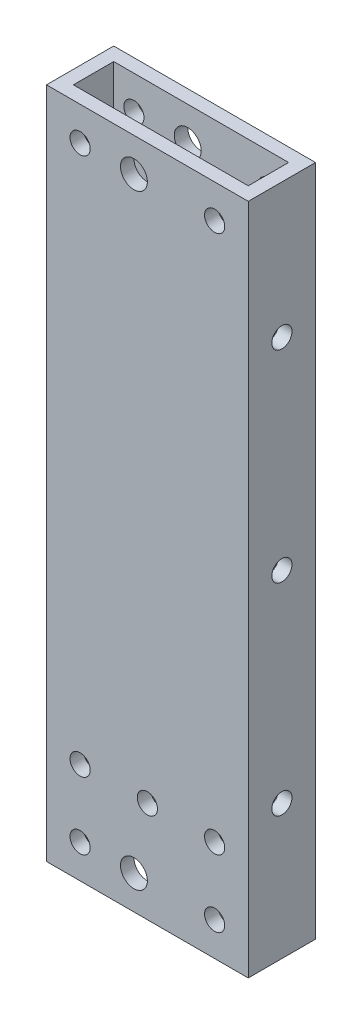
ISO-10303-21;
HEADER;
FILE_DESCRIPTION(('STEP AP214'),'2;1');
FILE_NAME('part.step','',(''),(''),'','','');
FILE_SCHEMA(('AUTOMOTIVE_DESIGN { 1 0 10303 214 1 1 1 1 }'));
ENDSEC;
DATA;
#1=APPLICATION_CONTEXT('core data for automotive mechanical design processes');
#2=APPLICATION_PROTOCOL_DEFINITION('international standard','automotive_design',2000,#1);
#3=PRODUCT_CONTEXT('',#1,'mechanical');
#4=PRODUCT('Part','Part','',(#3));
#5=PRODUCT_RELATED_PRODUCT_CATEGORY('part','',(#4));
#6=PRODUCT_DEFINITION_FORMATION('','',#4);
#7=PRODUCT_DEFINITION_CONTEXT('part definition',#1,'design');
#8=PRODUCT_DEFINITION('design','',#6,#7);
#9=PRODUCT_DEFINITION_SHAPE('','',#8);
#10=(LENGTH_UNIT() NAMED_UNIT(*) SI_UNIT(.MILLI.,.METRE.));
#11=(NAMED_UNIT(*) PLANE_ANGLE_UNIT() SI_UNIT($,.RADIAN.));
#12=(NAMED_UNIT(*) SI_UNIT($,.STERADIAN.) SOLID_ANGLE_UNIT());
#13=UNCERTAINTY_MEASURE_WITH_UNIT(LENGTH_MEASURE(1.E-05),#10,'distance_accuracy_value','');
#14=(GEOMETRIC_REPRESENTATION_CONTEXT(3) GLOBAL_UNCERTAINTY_ASSIGNED_CONTEXT((#13)) GLOBAL_UNIT_ASSIGNED_CONTEXT((#10,
#11,#12)) REPRESENTATION_CONTEXT('',''));
#15=CARTESIAN_POINT('',(0.,0.,0.));
#16=DIRECTION('',(0.,0.,1.));
#17=DIRECTION('',(1.,0.,0.));
#18=AXIS2_PLACEMENT_3D('',#15,#16,#17);
#19=CARTESIAN_POINT('',(0.,50.,0.));
#20=DIRECTION('',(0.,1.,0.));
#21=DIRECTION('',(0.,0.,1.));
#22=AXIS2_PLACEMENT_3D('',#19,#20,#21);
#23=PLANE('',#22);
#24=DIRECTION('',(0.,0.,-1.));
#25=VECTOR('',#24,1.);
#26=CARTESIAN_POINT('',(15.,50.,-5.));
#27=LINE('',#26,#25);
#28=CARTESIAN_POINT('',(15.,50.,5.));
#29=VERTEX_POINT('',#28);
#30=CARTESIAN_POINT('',(15.,50.,-5.));
#31=VERTEX_POINT('',#30);
#32=EDGE_CURVE('E140',#29,#31,#27,.T.);
#33=ORIENTED_EDGE('',*,*,#32,.T.);
#34=DIRECTION('',(-1.,0.,0.));
#35=VECTOR('',#34,1.);
#36=CARTESIAN_POINT('',(-15.,50.,-5.));
#37=LINE('',#36,#35);
#38=CARTESIAN_POINT('',(-15.,50.,-5.));
#39=VERTEX_POINT('',#38);
#40=EDGE_CURVE('E143',#31,#39,#37,.T.);
#41=ORIENTED_EDGE('',*,*,#40,.T.);
#42=DIRECTION('',(0.,0.,1.));
#43=VECTOR('',#42,1.);
#44=CARTESIAN_POINT('',(-15.,50.,-5.));
#45=LINE('',#44,#43);
#46=CARTESIAN_POINT('',(-15.,50.,5.));
#47=VERTEX_POINT('',#46);
#48=EDGE_CURVE('E146',#39,#47,#45,.T.);
#49=ORIENTED_EDGE('',*,*,#48,.T.);
#50=DIRECTION('',(1.,0.,0.));
#51=VECTOR('',#50,1.);
#52=CARTESIAN_POINT('',(-15.,50.,5.));
#53=LINE('',#52,#51);
#54=EDGE_CURVE('E148',#47,#29,#53,.T.);
#55=ORIENTED_EDGE('',*,*,#54,.T.);
#56=EDGE_LOOP('',(#33,#41,#49,#55));
#57=FACE_BOUND('',#56,.T.);
#58=DIRECTION('',(-1.,0.,0.));
#59=VECTOR('',#58,1.);
#60=CARTESIAN_POINT('',(-13.,50.,-3.));
#61=LINE('',#60,#59);
#62=CARTESIAN_POINT('',(13.,50.,-3.));
#63=VERTEX_POINT('',#62);
#64=CARTESIAN_POINT('',(-13.,50.,-3.));
#65=VERTEX_POINT('',#64);
#66=EDGE_CURVE('E110',#63,#65,#61,.T.);
#67=ORIENTED_EDGE('',*,*,#66,.F.);
#68=DIRECTION('',(0.,0.,-1.));
#69=VECTOR('',#68,1.);
#70=CARTESIAN_POINT('',(13.,50.,-3.));
#71=LINE('',#70,#69);
#72=CARTESIAN_POINT('',(13.,50.,3.));
#73=VERTEX_POINT('',#72);
#74=EDGE_CURVE('E102',#73,#63,#71,.T.);
#75=ORIENTED_EDGE('',*,*,#74,.F.);
#76=DIRECTION('',(1.,0.,0.));
#77=VECTOR('',#76,1.);
#78=CARTESIAN_POINT('',(-13.,50.,3.));
#79=LINE('',#78,#77);
#80=CARTESIAN_POINT('',(-13.,50.,3.));
#81=VERTEX_POINT('',#80);
#82=EDGE_CURVE('E124',#81,#73,#79,.T.);
#83=ORIENTED_EDGE('',*,*,#82,.F.);
#84=DIRECTION('',(0.,0.,1.));
#85=VECTOR('',#84,1.);
#86=CARTESIAN_POINT('',(-13.,50.,-3.));
#87=LINE('',#86,#85);
#88=EDGE_CURVE('E122',#65,#81,#87,.T.);
#89=ORIENTED_EDGE('',*,*,#88,.F.);
#90=EDGE_LOOP('',(#67,#75,#83,#89));
#91=FACE_BOUND('',#90,.T.);
#92=ADVANCED_FACE('F35',(#57,#91),#23,.T.);
#93=CARTESIAN_POINT('',(0.,-50.,0.));
#94=DIRECTION('',(0.,1.,0.));
#95=DIRECTION('',(0.,0.,1.));
#96=AXIS2_PLACEMENT_3D('',#93,#94,#95);
#97=PLANE('',#96);
#98=DIRECTION('',(0.,0.,-1.));
#99=VECTOR('',#98,1.);
#100=CARTESIAN_POINT('',(15.,-50.,-5.));
#101=LINE('',#100,#99);
#102=CARTESIAN_POINT('',(15.,-50.,5.));
#103=VERTEX_POINT('',#102);
#104=CARTESIAN_POINT('',(15.,-50.,-5.));
#105=VERTEX_POINT('',#104);
#106=EDGE_CURVE('E118',#103,#105,#101,.T.);
#107=ORIENTED_EDGE('',*,*,#106,.F.);
#108=DIRECTION('',(1.,0.,0.));
#109=VECTOR('',#108,1.);
#110=CARTESIAN_POINT('',(-15.,-50.,5.));
#111=LINE('',#110,#109);
#112=CARTESIAN_POINT('',(-15.,-50.,5.));
#113=VERTEX_POINT('',#112);
#114=EDGE_CURVE('E144',#113,#103,#111,.T.);
#115=ORIENTED_EDGE('',*,*,#114,.F.);
#116=DIRECTION('',(0.,0.,1.));
#117=VECTOR('',#116,1.);
#118=CARTESIAN_POINT('',(-15.,-50.,-5.));
#119=LINE('',#118,#117);
#120=CARTESIAN_POINT('',(-15.,-50.,-5.));
#121=VERTEX_POINT('',#120);
#122=EDGE_CURVE('E155',#121,#113,#119,.T.);
#123=ORIENTED_EDGE('',*,*,#122,.F.);
#124=DIRECTION('',(-1.,0.,0.));
#125=VECTOR('',#124,1.);
#126=CARTESIAN_POINT('',(-15.,-50.,-5.));
#127=LINE('',#126,#125);
#128=EDGE_CURVE('E153',#105,#121,#127,.T.);
#129=ORIENTED_EDGE('',*,*,#128,.F.);
#130=EDGE_LOOP('',(#107,#115,#123,#129));
#131=FACE_BOUND('',#130,.T.);
#132=DIRECTION('',(0.,0.,-1.));
#133=VECTOR('',#132,1.);
#134=CARTESIAN_POINT('',(13.,-50.,-3.));
#135=LINE('',#134,#133);
#136=CARTESIAN_POINT('',(13.,-50.,3.));
#137=VERTEX_POINT('',#136);
#138=CARTESIAN_POINT('',(13.,-50.,-3.));
#139=VERTEX_POINT('',#138);
#140=EDGE_CURVE('E60',#137,#139,#135,.T.);
#141=ORIENTED_EDGE('',*,*,#140,.T.);
#142=DIRECTION('',(-1.,0.,0.));
#143=VECTOR('',#142,1.);
#144=CARTESIAN_POINT('',(-13.,-50.,-3.));
#145=LINE('',#144,#143);
#146=CARTESIAN_POINT('',(-13.,-50.,-3.));
#147=VERTEX_POINT('',#146);
#148=EDGE_CURVE('E117',#139,#147,#145,.T.);
#149=ORIENTED_EDGE('',*,*,#148,.T.);
#150=DIRECTION('',(0.,0.,1.));
#151=VECTOR('',#150,1.);
#152=CARTESIAN_POINT('',(-13.,-50.,-3.));
#153=LINE('',#152,#151);
#154=CARTESIAN_POINT('',(-13.,-50.,3.));
#155=VERTEX_POINT('',#154);
#156=EDGE_CURVE('E132',#147,#155,#153,.T.);
#157=ORIENTED_EDGE('',*,*,#156,.T.);
#158=DIRECTION('',(1.,0.,0.));
#159=VECTOR('',#158,1.);
#160=CARTESIAN_POINT('',(-13.,-50.,3.));
#161=LINE('',#160,#159);
#162=EDGE_CURVE('E111',#155,#137,#161,.T.);
#163=ORIENTED_EDGE('',*,*,#162,.T.);
#164=EDGE_LOOP('',(#141,#149,#157,#163));
#165=FACE_BOUND('',#164,.T.);
#166=ADVANCED_FACE('F335',(#131,#165),#97,.F.);
#167=CARTESIAN_POINT('',(15.,50.,-5.));
#168=DIRECTION('',(-1.,0.,0.));
#169=DIRECTION('',(0.,0.,1.));
#170=AXIS2_PLACEMENT_3D('',#167,#168,#169);
#171=PLANE('',#170);
#172=CARTESIAN_POINT('',(15.,29.9999999999999,-1.76247905159244E-12));
#173=DIRECTION('',(1.,0.,0.));
#174=DIRECTION('',(0.,0.,-1.));
#175=AXIS2_PLACEMENT_3D('',#172,#173,#174);
#176=CIRCLE('',#175,1.5);
#177=CARTESIAN_POINT('',(15.,29.9999999999999,-1.50000000000176));
#178=VERTEX_POINT('',#177);
#179=EDGE_CURVE('E378',#178,#178,#176,.T.);
#180=ORIENTED_EDGE('',*,*,#179,.F.);
#181=EDGE_LOOP('',(#180));
#182=FACE_BOUND('',#181,.T.);
#183=CARTESIAN_POINT('',(15.,0.,0.));
#184=DIRECTION('',(1.,0.,0.));
#185=DIRECTION('',(0.,0.,-1.));
#186=AXIS2_PLACEMENT_3D('',#183,#184,#185);
#187=CIRCLE('',#186,1.5);
#188=CARTESIAN_POINT('',(15.,0.,-1.5));
#189=VERTEX_POINT('',#188);
#190=EDGE_CURVE('E372',#189,#189,#187,.T.);
#191=ORIENTED_EDGE('',*,*,#190,.F.);
#192=EDGE_LOOP('',(#191));
#193=FACE_BOUND('',#192,.T.);
#194=CARTESIAN_POINT('',(15.,-30.,-1.76247905159244E-12));
#195=DIRECTION('',(1.,0.,0.));
#196=DIRECTION('',(0.,0.,-1.));
#197=AXIS2_PLACEMENT_3D('',#194,#195,#196);
#198=CIRCLE('',#197,1.5);
#199=CARTESIAN_POINT('',(15.,-30.,-1.50000000000176));
#200=VERTEX_POINT('',#199);
#201=EDGE_CURVE('E218',#200,#200,#198,.T.);
#202=ORIENTED_EDGE('',*,*,#201,.F.);
#203=EDGE_LOOP('',(#202));
#204=FACE_BOUND('',#203,.T.);
#205=ORIENTED_EDGE('',*,*,#106,.T.);
#206=DIRECTION('',(0.,-1.,0.));
#207=VECTOR('',#206,1.);
#208=CARTESIAN_POINT('',(15.,50.,-5.));
#209=LINE('',#208,#207);
#210=EDGE_CURVE('E11',#31,#105,#209,.T.);
#211=ORIENTED_EDGE('',*,*,#210,.F.);
#212=ORIENTED_EDGE('',*,*,#32,.F.);
#213=DIRECTION('',(0.,-1.,0.));
#214=VECTOR('',#213,1.);
#215=CARTESIAN_POINT('',(15.,50.,5.));
#216=LINE('',#215,#214);
#217=EDGE_CURVE('E150',#29,#103,#216,.T.);
#218=ORIENTED_EDGE('',*,*,#217,.T.);
#219=EDGE_LOOP('',(#205,#211,#212,#218));
#220=FACE_BOUND('',#219,.T.);
#221=ADVANCED_FACE('F37',(#182,#193,#204,#220),#171,.F.);
#222=CARTESIAN_POINT('',(-15.,50.,-5.));
#223=DIRECTION('',(0.,0.,1.));
#224=DIRECTION('',(1.,0.,0.));
#225=AXIS2_PLACEMENT_3D('',#222,#223,#224);
#226=PLANE('',#225);
#227=CARTESIAN_POINT('',(-10.0000000000125,-34.9999999999675,-5.));
#228=DIRECTION('',(0.,0.,1.));
#229=DIRECTION('',(1.,0.,0.));
#230=AXIS2_PLACEMENT_3D('',#227,#228,#229);
#231=CIRCLE('',#230,1.5);
#232=CARTESIAN_POINT('',(-8.50000000001254,-34.9999999999675,-5.));
#233=VERTEX_POINT('',#232);
#234=EDGE_CURVE('E232',#233,#233,#231,.T.);
#235=ORIENTED_EDGE('',*,*,#234,.T.);
#236=EDGE_LOOP('',(#235));
#237=FACE_BOUND('',#236,.T.);
#238=CARTESIAN_POINT('',(9.99999999998719,-34.9999999999676,-5.));
#239=DIRECTION('',(0.,0.,1.));
#240=DIRECTION('',(1.,0.,0.));
#241=AXIS2_PLACEMENT_3D('',#238,#239,#240);
#242=CIRCLE('',#241,1.5);
#243=CARTESIAN_POINT('',(11.4999999999872,-34.9999999999676,-5.));
#244=VERTEX_POINT('',#243);
#245=EDGE_CURVE('E225',#244,#244,#242,.T.);
#246=ORIENTED_EDGE('',*,*,#245,.T.);
#247=EDGE_LOOP('',(#246));
#248=FACE_BOUND('',#247,.T.);
#249=CARTESIAN_POINT('',(-1.26704202685346E-11,-34.9999999999676,-5.));
#250=DIRECTION('',(0.,0.,1.));
#251=DIRECTION('',(1.,0.,0.));
#252=AXIS2_PLACEMENT_3D('',#249,#250,#251);
#253=CIRCLE('',#252,1.5);
#254=CARTESIAN_POINT('',(1.49999999998733,-34.9999999999676,-5.));
#255=VERTEX_POINT('',#254);
#256=EDGE_CURVE('E193',#255,#255,#253,.T.);
#257=ORIENTED_EDGE('',*,*,#256,.T.);
#258=EDGE_LOOP('',(#257));
#259=FACE_BOUND('',#258,.T.);
#260=CARTESIAN_POINT('',(-10.,44.9999999999997,-5.));
#261=DIRECTION('',(0.,0.,-1.));
#262=DIRECTION('',(-1.,0.,0.));
#263=AXIS2_PLACEMENT_3D('',#260,#261,#262);
#264=CIRCLE('',#263,1.5);
#265=CARTESIAN_POINT('',(-11.5,44.9999999999997,-5.));
#266=VERTEX_POINT('',#265);
#267=EDGE_CURVE('E258',#266,#266,#264,.T.);
#268=ORIENTED_EDGE('',*,*,#267,.F.);
#269=EDGE_LOOP('',(#268));
#270=FACE_BOUND('',#269,.T.);
#271=CARTESIAN_POINT('',(10.,44.9999999999997,-5.));
#272=DIRECTION('',(0.,0.,-1.));
#273=DIRECTION('',(-1.,0.,0.));
#274=AXIS2_PLACEMENT_3D('',#271,#272,#273);
#275=CIRCLE('',#274,1.5);
#276=CARTESIAN_POINT('',(8.49999999999999,44.9999999999997,-5.));
#277=VERTEX_POINT('',#276);
#278=EDGE_CURVE('E264',#277,#277,#275,.T.);
#279=ORIENTED_EDGE('',*,*,#278,.F.);
#280=EDGE_LOOP('',(#279));
#281=FACE_BOUND('',#280,.T.);
#282=CARTESIAN_POINT('',(9.99999999999999,-44.9999999999997,-5.));
#283=DIRECTION('',(0.,0.,-1.));
#284=DIRECTION('',(1.,0.,0.));
#285=AXIS2_PLACEMENT_3D('',#282,#283,#284);
#286=CIRCLE('',#285,1.5);
#287=CARTESIAN_POINT('',(11.5,-44.9999999999997,-5.));
#288=VERTEX_POINT('',#287);
#289=EDGE_CURVE('E270',#288,#288,#286,.T.);
#290=ORIENTED_EDGE('',*,*,#289,.F.);
#291=EDGE_LOOP('',(#290));
#292=FACE_BOUND('',#291,.T.);
#293=CARTESIAN_POINT('',(-2.00000000000069,-44.9999999999997,-5.));
#294=DIRECTION('',(0.,0.,-1.));
#295=DIRECTION('',(1.,0.,0.));
#296=AXIS2_PLACEMENT_3D('',#293,#294,#295);
#297=CIRCLE('',#296,2.);
#298=CARTESIAN_POINT('',(-6.8434841127285E-13,-44.9999999999997,-5.));
#299=VERTEX_POINT('',#298);
#300=EDGE_CURVE('E251',#299,#299,#297,.T.);
#301=ORIENTED_EDGE('',*,*,#300,.F.);
#302=EDGE_LOOP('',(#301));
#303=FACE_BOUND('',#302,.T.);
#304=CARTESIAN_POINT('',(-10.,-44.9999999999997,-5.));
#305=DIRECTION('',(0.,0.,-1.));
#306=DIRECTION('',(1.,0.,0.));
#307=AXIS2_PLACEMENT_3D('',#304,#305,#306);
#308=CIRCLE('',#307,1.5);
#309=CARTESIAN_POINT('',(-8.50000000000001,-44.9999999999997,-5.));
#310=VERTEX_POINT('',#309);
#311=EDGE_CURVE('E247',#310,#310,#308,.T.);
#312=ORIENTED_EDGE('',*,*,#311,.F.);
#313=EDGE_LOOP('',(#312));
#314=FACE_BOUND('',#313,.T.);
#315=CARTESIAN_POINT('',(-2.00000000000068,44.9999999999997,-5.));
#316=DIRECTION('',(0.,0.,-1.));
#317=DIRECTION('',(-1.,0.,0.));
#318=AXIS2_PLACEMENT_3D('',#315,#316,#317);
#319=CIRCLE('',#318,2.);
#320=CARTESIAN_POINT('',(-4.00000000000068,44.9999999999997,-5.));
#321=VERTEX_POINT('',#320);
#322=EDGE_CURVE('E257',#321,#321,#319,.T.);
#323=ORIENTED_EDGE('',*,*,#322,.F.);
#324=EDGE_LOOP('',(#323));
#325=FACE_BOUND('',#324,.T.);
#326=ORIENTED_EDGE('',*,*,#128,.T.);
#327=DIRECTION('',(0.,-1.,0.));
#328=VECTOR('',#327,1.);
#329=CARTESIAN_POINT('',(-15.,50.,-5.));
#330=LINE('',#329,#328);
#331=EDGE_CURVE('E44',#39,#121,#330,.T.);
#332=ORIENTED_EDGE('',*,*,#331,.F.);
#333=ORIENTED_EDGE('',*,*,#40,.F.);
#334=ORIENTED_EDGE('',*,*,#210,.T.);
#335=EDGE_LOOP('',(#326,#332,#333,#334));
#336=FACE_BOUND('',#335,.T.);
#337=ADVANCED_FACE('F321',(#237,#248,#259,#270,#281,#292,#303,#314,#325,#336),#226,.F.);
#338=CARTESIAN_POINT('',(-15.,50.,-5.));
#339=DIRECTION('',(1.,0.,0.));
#340=DIRECTION('',(0.,0.,-1.));
#341=AXIS2_PLACEMENT_3D('',#338,#339,#340);
#342=PLANE('',#341);
#343=CARTESIAN_POINT('',(-15.,29.9999999999999,-1.76247905159244E-12));
#344=DIRECTION('',(1.,0.,0.));
#345=DIRECTION('',(0.,0.,-1.));
#346=AXIS2_PLACEMENT_3D('',#343,#344,#345);
#347=CIRCLE('',#346,1.5);
#348=CARTESIAN_POINT('',(-15.,29.9999999999999,-1.50000000000176));
#349=VERTEX_POINT('',#348);
#350=EDGE_CURVE('E205',#349,#349,#347,.T.);
#351=ORIENTED_EDGE('',*,*,#350,.T.);
#352=EDGE_LOOP('',(#351));
#353=FACE_BOUND('',#352,.T.);
#354=CARTESIAN_POINT('',(-15.,0.,0.));
#355=DIRECTION('',(1.,0.,0.));
#356=DIRECTION('',(0.,0.,-1.));
#357=AXIS2_PLACEMENT_3D('',#354,#355,#356);
#358=CIRCLE('',#357,1.5);
#359=CARTESIAN_POINT('',(-15.,0.,-1.5));
#360=VERTEX_POINT('',#359);
#361=EDGE_CURVE('E367',#360,#360,#358,.T.);
#362=ORIENTED_EDGE('',*,*,#361,.T.);
#363=EDGE_LOOP('',(#362));
#364=FACE_BOUND('',#363,.T.);
#365=CARTESIAN_POINT('',(-15.,-30.,-1.76247905159244E-12));
#366=DIRECTION('',(1.,0.,0.));
#367=DIRECTION('',(0.,0.,-1.));
#368=AXIS2_PLACEMENT_3D('',#365,#366,#367);
#369=CIRCLE('',#368,1.5);
#370=CARTESIAN_POINT('',(-15.,-30.,-1.50000000000176));
#371=VERTEX_POINT('',#370);
#372=EDGE_CURVE('E370',#371,#371,#369,.T.);
#373=ORIENTED_EDGE('',*,*,#372,.T.);
#374=EDGE_LOOP('',(#373));
#375=FACE_BOUND('',#374,.T.);
#376=ORIENTED_EDGE('',*,*,#122,.T.);
#377=DIRECTION('',(0.,-1.,0.));
#378=VECTOR('',#377,1.);
#379=CARTESIAN_POINT('',(-15.,50.,5.));
#380=LINE('',#379,#378);
#381=EDGE_CURVE('E160',#47,#113,#380,.T.);
#382=ORIENTED_EDGE('',*,*,#381,.F.);
#383=ORIENTED_EDGE('',*,*,#48,.F.);
#384=ORIENTED_EDGE('',*,*,#331,.T.);
#385=EDGE_LOOP('',(#376,#382,#383,#384));
#386=FACE_BOUND('',#385,.T.);
#387=ADVANCED_FACE('F324',(#353,#364,#375,#386),#342,.F.);
#388=CARTESIAN_POINT('',(-15.,50.,5.));
#389=DIRECTION('',(0.,0.,-1.));
#390=DIRECTION('',(-1.,0.,0.));
#391=AXIS2_PLACEMENT_3D('',#388,#389,#390);
#392=PLANE('',#391);
#393=CARTESIAN_POINT('',(-10.0000000000125,-34.9999999999675,5.));
#394=DIRECTION('',(0.,0.,1.));
#395=DIRECTION('',(1.,0.,0.));
#396=AXIS2_PLACEMENT_3D('',#393,#394,#395);
#397=CIRCLE('',#396,1.5);
#398=CARTESIAN_POINT('',(-8.50000000001254,-34.9999999999675,5.));
#399=VERTEX_POINT('',#398);
#400=EDGE_CURVE('E224',#399,#399,#397,.T.);
#401=ORIENTED_EDGE('',*,*,#400,.F.);
#402=EDGE_LOOP('',(#401));
#403=FACE_BOUND('',#402,.T.);
#404=CARTESIAN_POINT('',(9.99999999998719,-34.9999999999676,5.));
#405=DIRECTION('',(0.,0.,1.));
#406=DIRECTION('',(1.,0.,0.));
#407=AXIS2_PLACEMENT_3D('',#404,#405,#406);
#408=CIRCLE('',#407,1.5);
#409=CARTESIAN_POINT('',(11.4999999999872,-34.9999999999676,5.));
#410=VERTEX_POINT('',#409);
#411=EDGE_CURVE('E229',#410,#410,#408,.T.);
#412=ORIENTED_EDGE('',*,*,#411,.F.);
#413=EDGE_LOOP('',(#412));
#414=FACE_BOUND('',#413,.T.);
#415=CARTESIAN_POINT('',(-1.26704202685346E-11,-34.9999999999676,5.));
#416=DIRECTION('',(0.,0.,1.));
#417=DIRECTION('',(1.,0.,0.));
#418=AXIS2_PLACEMENT_3D('',#415,#416,#417);
#419=CIRCLE('',#418,1.5);
#420=CARTESIAN_POINT('',(1.49999999998733,-34.9999999999676,5.));
#421=VERTEX_POINT('',#420);
#422=EDGE_CURVE('E228',#421,#421,#419,.T.);
#423=ORIENTED_EDGE('',*,*,#422,.F.);
#424=EDGE_LOOP('',(#423));
#425=FACE_BOUND('',#424,.T.);
#426=CARTESIAN_POINT('',(-10.,44.9999999999997,5.));
#427=DIRECTION('',(0.,0.,-1.));
#428=DIRECTION('',(-1.,0.,0.));
#429=AXIS2_PLACEMENT_3D('',#426,#427,#428);
#430=CIRCLE('',#429,1.5);
#431=CARTESIAN_POINT('',(-11.5,44.9999999999997,5.));
#432=VERTEX_POINT('',#431);
#433=EDGE_CURVE('E254',#432,#432,#430,.T.);
#434=ORIENTED_EDGE('',*,*,#433,.T.);
#435=EDGE_LOOP('',(#434));
#436=FACE_BOUND('',#435,.T.);
#437=CARTESIAN_POINT('',(10.,44.9999999999997,5.));
#438=DIRECTION('',(0.,0.,-1.));
#439=DIRECTION('',(-1.,0.,0.));
#440=AXIS2_PLACEMENT_3D('',#437,#438,#439);
#441=CIRCLE('',#440,1.5);
#442=CARTESIAN_POINT('',(8.49999999999999,44.9999999999997,5.));
#443=VERTEX_POINT('',#442);
#444=EDGE_CURVE('E261',#443,#443,#441,.T.);
#445=ORIENTED_EDGE('',*,*,#444,.T.);
#446=EDGE_LOOP('',(#445));
#447=FACE_BOUND('',#446,.T.);
#448=CARTESIAN_POINT('',(9.99999999999999,-44.9999999999997,5.));
#449=DIRECTION('',(0.,0.,-1.));
#450=DIRECTION('',(1.,0.,0.));
#451=AXIS2_PLACEMENT_3D('',#448,#449,#450);
#452=CIRCLE('',#451,1.5);
#453=CARTESIAN_POINT('',(11.5,-44.9999999999997,5.));
#454=VERTEX_POINT('',#453);
#455=EDGE_CURVE('E267',#454,#454,#452,.T.);
#456=ORIENTED_EDGE('',*,*,#455,.T.);
#457=EDGE_LOOP('',(#456));
#458=FACE_BOUND('',#457,.T.);
#459=CARTESIAN_POINT('',(-2.00000000000069,-44.9999999999997,5.));
#460=DIRECTION('',(0.,0.,-1.));
#461=DIRECTION('',(1.,0.,0.));
#462=AXIS2_PLACEMENT_3D('',#459,#460,#461);
#463=CIRCLE('',#462,2.);
#464=CARTESIAN_POINT('',(-6.8434841127285E-13,-44.9999999999997,5.));
#465=VERTEX_POINT('',#464);
#466=EDGE_CURVE('E273',#465,#465,#463,.T.);
#467=ORIENTED_EDGE('',*,*,#466,.T.);
#468=EDGE_LOOP('',(#467));
#469=FACE_BOUND('',#468,.T.);
#470=CARTESIAN_POINT('',(-10.,-44.9999999999997,5.));
#471=DIRECTION('',(0.,0.,-1.));
#472=DIRECTION('',(1.,0.,0.));
#473=AXIS2_PLACEMENT_3D('',#470,#471,#472);
#474=CIRCLE('',#473,1.5);
#475=CARTESIAN_POINT('',(-8.50000000000001,-44.9999999999997,5.));
#476=VERTEX_POINT('',#475);
#477=EDGE_CURVE('E248',#476,#476,#474,.T.);
#478=ORIENTED_EDGE('',*,*,#477,.T.);
#479=EDGE_LOOP('',(#478));
#480=FACE_BOUND('',#479,.T.);
#481=CARTESIAN_POINT('',(-2.00000000000068,44.9999999999997,5.));
#482=DIRECTION('',(0.,0.,-1.));
#483=DIRECTION('',(-1.,0.,0.));
#484=AXIS2_PLACEMENT_3D('',#481,#482,#483);
#485=CIRCLE('',#484,2.);
#486=CARTESIAN_POINT('',(-4.00000000000068,44.9999999999997,5.));
#487=VERTEX_POINT('',#486);
#488=EDGE_CURVE('E169',#487,#487,#485,.T.);
#489=ORIENTED_EDGE('',*,*,#488,.T.);
#490=EDGE_LOOP('',(#489));
#491=FACE_BOUND('',#490,.T.);
#492=ORIENTED_EDGE('',*,*,#114,.T.);
#493=ORIENTED_EDGE('',*,*,#217,.F.);
#494=ORIENTED_EDGE('',*,*,#54,.F.);
#495=ORIENTED_EDGE('',*,*,#381,.T.);
#496=EDGE_LOOP('',(#492,#493,#494,#495));
#497=FACE_BOUND('',#496,.T.);
#498=ADVANCED_FACE('F339',(#403,#414,#425,#436,#447,#458,#469,#480,#491,#497),#392,.F.);
#499=CARTESIAN_POINT('',(13.,50.,-3.));
#500=DIRECTION('',(-1.,0.,0.));
#501=DIRECTION('',(0.,0.,1.));
#502=AXIS2_PLACEMENT_3D('',#499,#500,#501);
#503=PLANE('',#502);
#504=CARTESIAN_POINT('',(13.,29.9999999999999,-1.76247905159244E-12));
#505=DIRECTION('',(-1.,0.,0.));
#506=DIRECTION('',(0.,0.,1.));
#507=AXIS2_PLACEMENT_3D('',#504,#505,#506);
#508=CIRCLE('',#507,1.5);
#509=CARTESIAN_POINT('',(13.,29.9999999999999,1.49999999999824));
#510=VERTEX_POINT('',#509);
#511=EDGE_CURVE('E221',#510,#510,#508,.T.);
#512=ORIENTED_EDGE('',*,*,#511,.F.);
#513=EDGE_LOOP('',(#512));
#514=FACE_BOUND('',#513,.T.);
#515=CARTESIAN_POINT('',(13.,0.,0.));
#516=DIRECTION('',(-1.,0.,0.));
#517=DIRECTION('',(0.,0.,1.));
#518=AXIS2_PLACEMENT_3D('',#515,#516,#517);
#519=CIRCLE('',#518,1.5);
#520=CARTESIAN_POINT('',(13.,0.,1.5));
#521=VERTEX_POINT('',#520);
#522=EDGE_CURVE('E208',#521,#521,#519,.T.);
#523=ORIENTED_EDGE('',*,*,#522,.F.);
#524=EDGE_LOOP('',(#523));
#525=FACE_BOUND('',#524,.T.);
#526=CARTESIAN_POINT('',(13.,-30.,-1.76247905159244E-12));
#527=DIRECTION('',(-1.,0.,0.));
#528=DIRECTION('',(0.,0.,1.));
#529=AXIS2_PLACEMENT_3D('',#526,#527,#528);
#530=CIRCLE('',#529,1.5);
#531=CARTESIAN_POINT('',(13.,-30.,1.49999999999824));
#532=VERTEX_POINT('',#531);
#533=EDGE_CURVE('E204',#532,#532,#530,.T.);
#534=ORIENTED_EDGE('',*,*,#533,.F.);
#535=EDGE_LOOP('',(#534));
#536=FACE_BOUND('',#535,.T.);
#537=ORIENTED_EDGE('',*,*,#140,.F.);
#538=DIRECTION('',(0.,-1.,0.));
#539=VECTOR('',#538,1.);
#540=CARTESIAN_POINT('',(13.,50.,3.));
#541=LINE('',#540,#539);
#542=EDGE_CURVE('E106',#73,#137,#541,.T.);
#543=ORIENTED_EDGE('',*,*,#542,.F.);
#544=ORIENTED_EDGE('',*,*,#74,.T.);
#545=DIRECTION('',(0.,-1.,0.));
#546=VECTOR('',#545,1.);
#547=CARTESIAN_POINT('',(13.,50.,-3.));
#548=LINE('',#547,#546);
#549=EDGE_CURVE('E105',#63,#139,#548,.T.);
#550=ORIENTED_EDGE('',*,*,#549,.T.);
#551=EDGE_LOOP('',(#537,#543,#544,#550));
#552=FACE_BOUND('',#551,.T.);
#553=ADVANCED_FACE('F104',(#514,#525,#536,#552),#503,.T.);
#554=CARTESIAN_POINT('',(-13.,50.,-3.));
#555=DIRECTION('',(0.,0.,1.));
#556=DIRECTION('',(1.,0.,0.));
#557=AXIS2_PLACEMENT_3D('',#554,#555,#556);
#558=PLANE('',#557);
#559=CARTESIAN_POINT('',(-10.0000000000125,-34.9999999999675,-3.));
#560=DIRECTION('',(0.,0.,1.));
#561=DIRECTION('',(1.,0.,0.));
#562=AXIS2_PLACEMENT_3D('',#559,#560,#561);
#563=CIRCLE('',#562,1.5);
#564=CARTESIAN_POINT('',(-8.50000000001254,-34.9999999999675,-3.));
#565=VERTEX_POINT('',#564);
#566=EDGE_CURVE('E201',#565,#565,#563,.T.);
#567=ORIENTED_EDGE('',*,*,#566,.F.);
#568=EDGE_LOOP('',(#567));
#569=FACE_BOUND('',#568,.T.);
#570=CARTESIAN_POINT('',(9.99999999998719,-34.9999999999676,-3.));
#571=DIRECTION('',(0.,0.,1.));
#572=DIRECTION('',(1.,0.,0.));
#573=AXIS2_PLACEMENT_3D('',#570,#571,#572);
#574=CIRCLE('',#573,1.5);
#575=CARTESIAN_POINT('',(11.4999999999872,-34.9999999999676,-3.));
#576=VERTEX_POINT('',#575);
#577=EDGE_CURVE('E197',#576,#576,#574,.T.);
#578=ORIENTED_EDGE('',*,*,#577,.F.);
#579=EDGE_LOOP('',(#578));
#580=FACE_BOUND('',#579,.T.);
#581=CARTESIAN_POINT('',(-1.26704202685346E-11,-34.9999999999676,-3.));
#582=DIRECTION('',(0.,0.,1.));
#583=DIRECTION('',(1.,0.,0.));
#584=AXIS2_PLACEMENT_3D('',#581,#582,#583);
#585=CIRCLE('',#584,1.5);
#586=CARTESIAN_POINT('',(1.49999999998733,-34.9999999999676,-3.));
#587=VERTEX_POINT('',#586);
#588=EDGE_CURVE('E192',#587,#587,#585,.T.);
#589=ORIENTED_EDGE('',*,*,#588,.F.);
#590=EDGE_LOOP('',(#589));
#591=FACE_BOUND('',#590,.T.);
#592=CARTESIAN_POINT('',(-10.,44.9999999999997,-3.));
#593=DIRECTION('',(0.,0.,1.));
#594=DIRECTION('',(1.,0.,0.));
#595=AXIS2_PLACEMENT_3D('',#592,#593,#594);
#596=CIRCLE('',#595,1.5);
#597=CARTESIAN_POINT('',(-8.5,44.9999999999997,-3.));
#598=VERTEX_POINT('',#597);
#599=EDGE_CURVE('E130',#598,#598,#596,.T.);
#600=ORIENTED_EDGE('',*,*,#599,.F.);
#601=EDGE_LOOP('',(#600));
#602=FACE_BOUND('',#601,.T.);
#603=CARTESIAN_POINT('',(10.,44.9999999999997,-3.));
#604=DIRECTION('',(0.,0.,1.));
#605=DIRECTION('',(1.,0.,0.));
#606=AXIS2_PLACEMENT_3D('',#603,#604,#605);
#607=CIRCLE('',#606,1.5);
#608=CARTESIAN_POINT('',(11.5,44.9999999999997,-3.));
#609=VERTEX_POINT('',#608);
#610=EDGE_CURVE('E185',#609,#609,#607,.T.);
#611=ORIENTED_EDGE('',*,*,#610,.F.);
#612=EDGE_LOOP('',(#611));
#613=FACE_BOUND('',#612,.T.);
#614=CARTESIAN_POINT('',(9.99999999999999,-44.9999999999997,-3.));
#615=DIRECTION('',(0.,0.,1.));
#616=DIRECTION('',(1.,0.,0.));
#617=AXIS2_PLACEMENT_3D('',#614,#615,#616);
#618=CIRCLE('',#617,1.5);
#619=CARTESIAN_POINT('',(11.5,-44.9999999999997,-3.));
#620=VERTEX_POINT('',#619);
#621=EDGE_CURVE('E181',#620,#620,#618,.T.);
#622=ORIENTED_EDGE('',*,*,#621,.F.);
#623=EDGE_LOOP('',(#622));
#624=FACE_BOUND('',#623,.T.);
#625=CARTESIAN_POINT('',(-2.00000000000069,-44.9999999999997,-3.));
#626=DIRECTION('',(0.,0.,1.));
#627=DIRECTION('',(1.,0.,0.));
#628=AXIS2_PLACEMENT_3D('',#625,#626,#627);
#629=CIRCLE('',#628,2.);
#630=CARTESIAN_POINT('',(-6.8434841127285E-13,-44.9999999999997,-3.));
#631=VERTEX_POINT('',#630);
#632=EDGE_CURVE('E177',#631,#631,#629,.T.);
#633=ORIENTED_EDGE('',*,*,#632,.F.);
#634=EDGE_LOOP('',(#633));
#635=FACE_BOUND('',#634,.T.);
#636=CARTESIAN_POINT('',(-10.,-44.9999999999997,-3.));
#637=DIRECTION('',(0.,0.,1.));
#638=DIRECTION('',(1.,0.,0.));
#639=AXIS2_PLACEMENT_3D('',#636,#637,#638);
#640=CIRCLE('',#639,1.5);
#641=CARTESIAN_POINT('',(-8.50000000000001,-44.9999999999997,-3.));
#642=VERTEX_POINT('',#641);
#643=EDGE_CURVE('E173',#642,#642,#640,.T.);
#644=ORIENTED_EDGE('',*,*,#643,.F.);
#645=EDGE_LOOP('',(#644));
#646=FACE_BOUND('',#645,.T.);
#647=CARTESIAN_POINT('',(-2.00000000000068,44.9999999999997,-3.));
#648=DIRECTION('',(0.,0.,1.));
#649=DIRECTION('',(1.,0.,0.));
#650=AXIS2_PLACEMENT_3D('',#647,#648,#649);
#651=CIRCLE('',#650,2.);
#652=CARTESIAN_POINT('',(-6.7394007041699E-13,44.9999999999997,-3.));
#653=VERTEX_POINT('',#652);
#654=EDGE_CURVE('E168',#653,#653,#651,.T.);
#655=ORIENTED_EDGE('',*,*,#654,.F.);
#656=EDGE_LOOP('',(#655));
#657=FACE_BOUND('',#656,.T.);
#658=ORIENTED_EDGE('',*,*,#148,.F.);
#659=ORIENTED_EDGE('',*,*,#549,.F.);
#660=ORIENTED_EDGE('',*,*,#66,.T.);
#661=DIRECTION('',(0.,-1.,0.));
#662=VECTOR('',#661,1.);
#663=CARTESIAN_POINT('',(-13.,50.,-3.));
#664=LINE('',#663,#662);
#665=EDGE_CURVE('E119',#65,#147,#664,.T.);
#666=ORIENTED_EDGE('',*,*,#665,.T.);
#667=EDGE_LOOP('',(#658,#659,#660,#666));
#668=FACE_BOUND('',#667,.T.);
#669=ADVANCED_FACE('F114',(#569,#580,#591,#602,#613,#624,#635,#646,#657,#668),#558,.T.);
#670=CARTESIAN_POINT('',(-13.,50.,-3.));
#671=DIRECTION('',(1.,0.,0.));
#672=DIRECTION('',(0.,0.,-1.));
#673=AXIS2_PLACEMENT_3D('',#670,#671,#672);
#674=PLANE('',#673);
#675=CARTESIAN_POINT('',(-13.,29.9999999999999,-1.76247905159244E-12));
#676=DIRECTION('',(1.,0.,0.));
#677=DIRECTION('',(0.,0.,-1.));
#678=AXIS2_PLACEMENT_3D('',#675,#676,#677);
#679=CIRCLE('',#678,1.5);
#680=CARTESIAN_POINT('',(-13.,29.9999999999999,-1.50000000000176));
#681=VERTEX_POINT('',#680);
#682=EDGE_CURVE('E39',#681,#681,#679,.T.);
#683=ORIENTED_EDGE('',*,*,#682,.F.);
#684=EDGE_LOOP('',(#683));
#685=FACE_BOUND('',#684,.T.);
#686=CARTESIAN_POINT('',(-13.,0.,0.));
#687=DIRECTION('',(1.,0.,0.));
#688=DIRECTION('',(0.,0.,-1.));
#689=AXIS2_PLACEMENT_3D('',#686,#687,#688);
#690=CIRCLE('',#689,1.5);
#691=CARTESIAN_POINT('',(-13.,0.,-1.5));
#692=VERTEX_POINT('',#691);
#693=EDGE_CURVE('E206',#692,#692,#690,.T.);
#694=ORIENTED_EDGE('',*,*,#693,.F.);
#695=EDGE_LOOP('',(#694));
#696=FACE_BOUND('',#695,.T.);
#697=CARTESIAN_POINT('',(-13.,-30.,-1.76247905159244E-12));
#698=DIRECTION('',(1.,0.,0.));
#699=DIRECTION('',(0.,0.,-1.));
#700=AXIS2_PLACEMENT_3D('',#697,#698,#699);
#701=CIRCLE('',#700,1.5);
#702=CARTESIAN_POINT('',(-13.,-30.,-1.50000000000176));
#703=VERTEX_POINT('',#702);
#704=EDGE_CURVE('E202',#703,#703,#701,.T.);
#705=ORIENTED_EDGE('',*,*,#704,.F.);
#706=EDGE_LOOP('',(#705));
#707=FACE_BOUND('',#706,.T.);
#708=ORIENTED_EDGE('',*,*,#156,.F.);
#709=ORIENTED_EDGE('',*,*,#665,.F.);
#710=ORIENTED_EDGE('',*,*,#88,.T.);
#711=DIRECTION('',(0.,-1.,0.));
#712=VECTOR('',#711,1.);
#713=CARTESIAN_POINT('',(-13.,50.,3.));
#714=LINE('',#713,#712);
#715=EDGE_CURVE('E52',#81,#155,#714,.T.);
#716=ORIENTED_EDGE('',*,*,#715,.T.);
#717=EDGE_LOOP('',(#708,#709,#710,#716));
#718=FACE_BOUND('',#717,.T.);
#719=ADVANCED_FACE('F299',(#685,#696,#707,#718),#674,.T.);
#720=CARTESIAN_POINT('',(-13.,50.,3.));
#721=DIRECTION('',(0.,0.,-1.));
#722=DIRECTION('',(-1.,0.,0.));
#723=AXIS2_PLACEMENT_3D('',#720,#721,#722);
#724=PLANE('',#723);
#725=CARTESIAN_POINT('',(-10.0000000000125,-34.9999999999675,3.));
#726=DIRECTION('',(0.,0.,-1.));
#727=DIRECTION('',(-1.,0.,0.));
#728=AXIS2_PLACEMENT_3D('',#725,#726,#727);
#729=CIRCLE('',#728,1.5);
#730=CARTESIAN_POINT('',(-11.5000000000125,-34.9999999999675,3.));
#731=VERTEX_POINT('',#730);
#732=EDGE_CURVE('E198',#731,#731,#729,.T.);
#733=ORIENTED_EDGE('',*,*,#732,.F.);
#734=EDGE_LOOP('',(#733));
#735=FACE_BOUND('',#734,.T.);
#736=CARTESIAN_POINT('',(9.99999999998719,-34.9999999999676,3.));
#737=DIRECTION('',(0.,0.,-1.));
#738=DIRECTION('',(-1.,0.,0.));
#739=AXIS2_PLACEMENT_3D('',#736,#737,#738);
#740=CIRCLE('',#739,1.5);
#741=CARTESIAN_POINT('',(8.49999999998719,-34.9999999999676,3.));
#742=VERTEX_POINT('',#741);
#743=EDGE_CURVE('E194',#742,#742,#740,.T.);
#744=ORIENTED_EDGE('',*,*,#743,.F.);
#745=EDGE_LOOP('',(#744));
#746=FACE_BOUND('',#745,.T.);
#747=CARTESIAN_POINT('',(-1.26704202685346E-11,-34.9999999999676,3.));
#748=DIRECTION('',(0.,0.,-1.));
#749=DIRECTION('',(-1.,0.,0.));
#750=AXIS2_PLACEMENT_3D('',#747,#748,#749);
#751=CIRCLE('',#750,1.5);
#752=CARTESIAN_POINT('',(-1.50000000001267,-34.9999999999676,3.));
#753=VERTEX_POINT('',#752);
#754=EDGE_CURVE('E189',#753,#753,#751,.T.);
#755=ORIENTED_EDGE('',*,*,#754,.F.);
#756=EDGE_LOOP('',(#755));
#757=FACE_BOUND('',#756,.T.);
#758=CARTESIAN_POINT('',(-10.,44.9999999999997,3.));
#759=DIRECTION('',(0.,0.,-1.));
#760=DIRECTION('',(-1.,0.,0.));
#761=AXIS2_PLACEMENT_3D('',#758,#759,#760);
#762=CIRCLE('',#761,1.5);
#763=CARTESIAN_POINT('',(-11.5,44.9999999999997,3.));
#764=VERTEX_POINT('',#763);
#765=EDGE_CURVE('E186',#764,#764,#762,.T.);
#766=ORIENTED_EDGE('',*,*,#765,.F.);
#767=EDGE_LOOP('',(#766));
#768=FACE_BOUND('',#767,.T.);
#769=CARTESIAN_POINT('',(10.,44.9999999999997,3.));
#770=DIRECTION('',(0.,0.,-1.));
#771=DIRECTION('',(-1.,0.,0.));
#772=AXIS2_PLACEMENT_3D('',#769,#770,#771);
#773=CIRCLE('',#772,1.5);
#774=CARTESIAN_POINT('',(8.49999999999999,44.9999999999997,3.));
#775=VERTEX_POINT('',#774);
#776=EDGE_CURVE('E182',#775,#775,#773,.T.);
#777=ORIENTED_EDGE('',*,*,#776,.F.);
#778=EDGE_LOOP('',(#777));
#779=FACE_BOUND('',#778,.T.);
#780=CARTESIAN_POINT('',(9.99999999999999,-44.9999999999997,3.));
#781=DIRECTION('',(0.,0.,-1.));
#782=DIRECTION('',(-1.,0.,0.));
#783=AXIS2_PLACEMENT_3D('',#780,#781,#782);
#784=CIRCLE('',#783,1.5);
#785=CARTESIAN_POINT('',(8.49999999999999,-44.9999999999997,3.));
#786=VERTEX_POINT('',#785);
#787=EDGE_CURVE('E178',#786,#786,#784,.T.);
#788=ORIENTED_EDGE('',*,*,#787,.F.);
#789=EDGE_LOOP('',(#788));
#790=FACE_BOUND('',#789,.T.);
#791=CARTESIAN_POINT('',(-2.00000000000069,-44.9999999999997,3.));
#792=DIRECTION('',(0.,0.,-1.));
#793=DIRECTION('',(-1.,0.,0.));
#794=AXIS2_PLACEMENT_3D('',#791,#792,#793);
#795=CIRCLE('',#794,2.);
#796=CARTESIAN_POINT('',(-4.00000000000069,-44.9999999999997,3.));
#797=VERTEX_POINT('',#796);
#798=EDGE_CURVE('E174',#797,#797,#795,.T.);
#799=ORIENTED_EDGE('',*,*,#798,.F.);
#800=EDGE_LOOP('',(#799));
#801=FACE_BOUND('',#800,.T.);
#802=CARTESIAN_POINT('',(-10.,-44.9999999999997,3.));
#803=DIRECTION('',(0.,0.,-1.));
#804=DIRECTION('',(-1.,0.,0.));
#805=AXIS2_PLACEMENT_3D('',#802,#803,#804);
#806=CIRCLE('',#805,1.5);
#807=CARTESIAN_POINT('',(-11.5,-44.9999999999997,3.));
#808=VERTEX_POINT('',#807);
#809=EDGE_CURVE('E170',#808,#808,#806,.T.);
#810=ORIENTED_EDGE('',*,*,#809,.F.);
#811=EDGE_LOOP('',(#810));
#812=FACE_BOUND('',#811,.T.);
#813=CARTESIAN_POINT('',(-2.00000000000068,44.9999999999997,3.));
#814=DIRECTION('',(0.,0.,-1.));
#815=DIRECTION('',(-1.,0.,0.));
#816=AXIS2_PLACEMENT_3D('',#813,#814,#815);
#817=CIRCLE('',#816,2.);
#818=CARTESIAN_POINT('',(-4.00000000000068,44.9999999999997,3.));
#819=VERTEX_POINT('',#818);
#820=EDGE_CURVE('E165',#819,#819,#817,.T.);
#821=ORIENTED_EDGE('',*,*,#820,.F.);
#822=EDGE_LOOP('',(#821));
#823=FACE_BOUND('',#822,.T.);
#824=ORIENTED_EDGE('',*,*,#162,.F.);
#825=ORIENTED_EDGE('',*,*,#715,.F.);
#826=ORIENTED_EDGE('',*,*,#82,.T.);
#827=ORIENTED_EDGE('',*,*,#542,.T.);
#828=EDGE_LOOP('',(#824,#825,#826,#827));
#829=FACE_BOUND('',#828,.T.);
#830=ADVANCED_FACE('F421',(#735,#746,#757,#768,#779,#790,#801,#812,#823,#829),#724,.T.);
#831=CARTESIAN_POINT('',(-2.00000000000068,44.9999999999997,5.));
#832=DIRECTION('',(0.,0.,-1.));
#833=DIRECTION('',(-1.,0.,0.));
#834=AXIS2_PLACEMENT_3D('',#831,#832,#833);
#835=CYLINDRICAL_SURFACE('',#834,2.);
#836=ORIENTED_EDGE('',*,*,#820,.T.);
#837=EDGE_LOOP('',(#836));
#838=FACE_BOUND('',#837,.T.);
#839=ORIENTED_EDGE('',*,*,#488,.F.);
#840=EDGE_LOOP('',(#839));
#841=FACE_BOUND('',#840,.T.);
#842=ADVANCED_FACE('F318',(#838,#841),#835,.F.);
#843=CARTESIAN_POINT('',(-10.,-44.9999999999997,5.));
#844=DIRECTION('',(0.,0.,-1.));
#845=DIRECTION('',(-1.,0.,0.));
#846=AXIS2_PLACEMENT_3D('',#843,#844,#845);
#847=CYLINDRICAL_SURFACE('',#846,1.5);
#848=ORIENTED_EDGE('',*,*,#809,.T.);
#849=EDGE_LOOP('',(#848));
#850=FACE_BOUND('',#849,.T.);
#851=ORIENTED_EDGE('',*,*,#477,.F.);
#852=EDGE_LOOP('',(#851));
#853=FACE_BOUND('',#852,.T.);
#854=ADVANCED_FACE('F432',(#850,#853),#847,.F.);
#855=CARTESIAN_POINT('',(-2.00000000000069,-44.9999999999997,5.));
#856=DIRECTION('',(0.,0.,-1.));
#857=DIRECTION('',(-1.,0.,0.));
#858=AXIS2_PLACEMENT_3D('',#855,#856,#857);
#859=CYLINDRICAL_SURFACE('',#858,2.);
#860=ORIENTED_EDGE('',*,*,#798,.T.);
#861=EDGE_LOOP('',(#860));
#862=FACE_BOUND('',#861,.T.);
#863=ORIENTED_EDGE('',*,*,#466,.F.);
#864=EDGE_LOOP('',(#863));
#865=FACE_BOUND('',#864,.T.);
#866=ADVANCED_FACE('F437',(#862,#865),#859,.F.);
#867=CARTESIAN_POINT('',(9.99999999999999,-44.9999999999997,5.));
#868=DIRECTION('',(0.,0.,-1.));
#869=DIRECTION('',(-1.,0.,0.));
#870=AXIS2_PLACEMENT_3D('',#867,#868,#869);
#871=CYLINDRICAL_SURFACE('',#870,1.5);
#872=ORIENTED_EDGE('',*,*,#787,.T.);
#873=EDGE_LOOP('',(#872));
#874=FACE_BOUND('',#873,.T.);
#875=ORIENTED_EDGE('',*,*,#455,.F.);
#876=EDGE_LOOP('',(#875));
#877=FACE_BOUND('',#876,.T.);
#878=ADVANCED_FACE('F440',(#874,#877),#871,.F.);
#879=CARTESIAN_POINT('',(10.,44.9999999999997,5.));
#880=DIRECTION('',(0.,0.,-1.));
#881=DIRECTION('',(-1.,0.,0.));
#882=AXIS2_PLACEMENT_3D('',#879,#880,#881);
#883=CYLINDRICAL_SURFACE('',#882,1.5);
#884=ORIENTED_EDGE('',*,*,#776,.T.);
#885=EDGE_LOOP('',(#884));
#886=FACE_BOUND('',#885,.T.);
#887=ORIENTED_EDGE('',*,*,#444,.F.);
#888=EDGE_LOOP('',(#887));
#889=FACE_BOUND('',#888,.T.);
#890=ADVANCED_FACE('F445',(#886,#889),#883,.F.);
#891=CARTESIAN_POINT('',(-10.,44.9999999999997,5.));
#892=DIRECTION('',(0.,0.,-1.));
#893=DIRECTION('',(-1.,0.,0.));
#894=AXIS2_PLACEMENT_3D('',#891,#892,#893);
#895=CYLINDRICAL_SURFACE('',#894,1.5);
#896=ORIENTED_EDGE('',*,*,#765,.T.);
#897=EDGE_LOOP('',(#896));
#898=FACE_BOUND('',#897,.T.);
#899=ORIENTED_EDGE('',*,*,#433,.F.);
#900=EDGE_LOOP('',(#899));
#901=FACE_BOUND('',#900,.T.);
#902=ADVANCED_FACE('F316',(#898,#901),#895,.F.);
#903=ORIENTED_EDGE('',*,*,#654,.T.);
#904=EDGE_LOOP('',(#903));
#905=FACE_BOUND('',#904,.T.);
#906=ORIENTED_EDGE('',*,*,#322,.T.);
#907=EDGE_LOOP('',(#906));
#908=FACE_BOUND('',#907,.T.);
#909=ADVANCED_FACE('F312',(#905,#908),#835,.F.);
#910=ORIENTED_EDGE('',*,*,#643,.T.);
#911=EDGE_LOOP('',(#910));
#912=FACE_BOUND('',#911,.T.);
#913=ORIENTED_EDGE('',*,*,#311,.T.);
#914=EDGE_LOOP('',(#913));
#915=FACE_BOUND('',#914,.T.);
#916=ADVANCED_FACE('F315',(#912,#915),#847,.F.);
#917=ORIENTED_EDGE('',*,*,#632,.T.);
#918=EDGE_LOOP('',(#917));
#919=FACE_BOUND('',#918,.T.);
#920=ORIENTED_EDGE('',*,*,#300,.T.);
#921=EDGE_LOOP('',(#920));
#922=FACE_BOUND('',#921,.T.);
#923=ADVANCED_FACE('F442',(#919,#922),#859,.F.);
#924=ORIENTED_EDGE('',*,*,#621,.T.);
#925=EDGE_LOOP('',(#924));
#926=FACE_BOUND('',#925,.T.);
#927=ORIENTED_EDGE('',*,*,#289,.T.);
#928=EDGE_LOOP('',(#927));
#929=FACE_BOUND('',#928,.T.);
#930=ADVANCED_FACE('F447',(#926,#929),#871,.F.);
#931=ORIENTED_EDGE('',*,*,#610,.T.);
#932=EDGE_LOOP('',(#931));
#933=FACE_BOUND('',#932,.T.);
#934=ORIENTED_EDGE('',*,*,#278,.T.);
#935=EDGE_LOOP('',(#934));
#936=FACE_BOUND('',#935,.T.);
#937=ADVANCED_FACE('F451',(#933,#936),#883,.F.);
#938=ORIENTED_EDGE('',*,*,#599,.T.);
#939=EDGE_LOOP('',(#938));
#940=FACE_BOUND('',#939,.T.);
#941=ORIENTED_EDGE('',*,*,#267,.T.);
#942=EDGE_LOOP('',(#941));
#943=FACE_BOUND('',#942,.T.);
#944=ADVANCED_FACE('F294',(#940,#943),#895,.F.);
#945=CARTESIAN_POINT('',(-1.26704202685346E-11,-34.9999999999676,-5.));
#946=DIRECTION('',(0.,0.,1.));
#947=DIRECTION('',(1.,0.,0.));
#948=AXIS2_PLACEMENT_3D('',#945,#946,#947);
#949=CYLINDRICAL_SURFACE('',#948,1.5);
#950=ORIENTED_EDGE('',*,*,#754,.T.);
#951=EDGE_LOOP('',(#950));
#952=FACE_BOUND('',#951,.T.);
#953=ORIENTED_EDGE('',*,*,#422,.T.);
#954=EDGE_LOOP('',(#953));
#955=FACE_BOUND('',#954,.T.);
#956=ADVANCED_FACE('F458',(#952,#955),#949,.F.);
#957=CARTESIAN_POINT('',(9.99999999998719,-34.9999999999676,-5.));
#958=DIRECTION('',(0.,0.,1.));
#959=DIRECTION('',(1.,0.,0.));
#960=AXIS2_PLACEMENT_3D('',#957,#958,#959);
#961=CYLINDRICAL_SURFACE('',#960,1.5);
#962=ORIENTED_EDGE('',*,*,#743,.T.);
#963=EDGE_LOOP('',(#962));
#964=FACE_BOUND('',#963,.T.);
#965=ORIENTED_EDGE('',*,*,#411,.T.);
#966=EDGE_LOOP('',(#965));
#967=FACE_BOUND('',#966,.T.);
#968=ADVANCED_FACE('F460',(#964,#967),#961,.F.);
#969=CARTESIAN_POINT('',(-10.0000000000125,-34.9999999999675,-5.));
#970=DIRECTION('',(0.,0.,1.));
#971=DIRECTION('',(1.,0.,0.));
#972=AXIS2_PLACEMENT_3D('',#969,#970,#971);
#973=CYLINDRICAL_SURFACE('',#972,1.5);
#974=ORIENTED_EDGE('',*,*,#732,.T.);
#975=EDGE_LOOP('',(#974));
#976=FACE_BOUND('',#975,.T.);
#977=ORIENTED_EDGE('',*,*,#400,.T.);
#978=EDGE_LOOP('',(#977));
#979=FACE_BOUND('',#978,.T.);
#980=ADVANCED_FACE('F416',(#976,#979),#973,.F.);
#981=ORIENTED_EDGE('',*,*,#588,.T.);
#982=EDGE_LOOP('',(#981));
#983=FACE_BOUND('',#982,.T.);
#984=ORIENTED_EDGE('',*,*,#256,.F.);
#985=EDGE_LOOP('',(#984));
#986=FACE_BOUND('',#985,.T.);
#987=ADVANCED_FACE('F462',(#983,#986),#949,.F.);
#988=ORIENTED_EDGE('',*,*,#577,.T.);
#989=EDGE_LOOP('',(#988));
#990=FACE_BOUND('',#989,.T.);
#991=ORIENTED_EDGE('',*,*,#245,.F.);
#992=EDGE_LOOP('',(#991));
#993=FACE_BOUND('',#992,.T.);
#994=ADVANCED_FACE('F413',(#990,#993),#961,.F.);
#995=ORIENTED_EDGE('',*,*,#566,.T.);
#996=EDGE_LOOP('',(#995));
#997=FACE_BOUND('',#996,.T.);
#998=ORIENTED_EDGE('',*,*,#234,.F.);
#999=EDGE_LOOP('',(#998));
#1000=FACE_BOUND('',#999,.T.);
#1001=ADVANCED_FACE('F407',(#997,#1000),#973,.F.);
#1002=CARTESIAN_POINT('',(-15.,-30.,-1.76247905159244E-12));
#1003=DIRECTION('',(1.,0.,0.));
#1004=DIRECTION('',(0.,0.,-1.));
#1005=AXIS2_PLACEMENT_3D('',#1002,#1003,#1004);
#1006=CYLINDRICAL_SURFACE('',#1005,1.5);
#1007=ORIENTED_EDGE('',*,*,#704,.T.);
#1008=EDGE_LOOP('',(#1007));
#1009=FACE_BOUND('',#1008,.T.);
#1010=ORIENTED_EDGE('',*,*,#372,.F.);
#1011=EDGE_LOOP('',(#1010));
#1012=FACE_BOUND('',#1011,.T.);
#1013=ADVANCED_FACE('F395',(#1009,#1012),#1006,.F.);
#1014=CARTESIAN_POINT('',(-15.,0.,0.));
#1015=DIRECTION('',(1.,0.,0.));
#1016=DIRECTION('',(0.,0.,-1.));
#1017=AXIS2_PLACEMENT_3D('',#1014,#1015,#1016);
#1018=CYLINDRICAL_SURFACE('',#1017,1.5);
#1019=ORIENTED_EDGE('',*,*,#693,.T.);
#1020=EDGE_LOOP('',(#1019));
#1021=FACE_BOUND('',#1020,.T.);
#1022=ORIENTED_EDGE('',*,*,#361,.F.);
#1023=EDGE_LOOP('',(#1022));
#1024=FACE_BOUND('',#1023,.T.);
#1025=ADVANCED_FACE('F402',(#1021,#1024),#1018,.F.);
#1026=CARTESIAN_POINT('',(-15.,29.9999999999999,-1.76247905159244E-12));
#1027=DIRECTION('',(1.,0.,0.));
#1028=DIRECTION('',(0.,0.,-1.));
#1029=AXIS2_PLACEMENT_3D('',#1026,#1027,#1028);
#1030=CYLINDRICAL_SURFACE('',#1029,1.5);
#1031=ORIENTED_EDGE('',*,*,#682,.T.);
#1032=EDGE_LOOP('',(#1031));
#1033=FACE_BOUND('',#1032,.T.);
#1034=ORIENTED_EDGE('',*,*,#350,.F.);
#1035=EDGE_LOOP('',(#1034));
#1036=FACE_BOUND('',#1035,.T.);
#1037=ADVANCED_FACE('F393',(#1033,#1036),#1030,.F.);
#1038=ORIENTED_EDGE('',*,*,#533,.T.);
#1039=EDGE_LOOP('',(#1038));
#1040=FACE_BOUND('',#1039,.T.);
#1041=ORIENTED_EDGE('',*,*,#201,.T.);
#1042=EDGE_LOOP('',(#1041));
#1043=FACE_BOUND('',#1042,.T.);
#1044=ADVANCED_FACE('F390',(#1040,#1043),#1006,.F.);
#1045=ORIENTED_EDGE('',*,*,#522,.T.);
#1046=EDGE_LOOP('',(#1045));
#1047=FACE_BOUND('',#1046,.T.);
#1048=ORIENTED_EDGE('',*,*,#190,.T.);
#1049=EDGE_LOOP('',(#1048));
#1050=FACE_BOUND('',#1049,.T.);
#1051=ADVANCED_FACE('F392',(#1047,#1050),#1018,.F.);
#1052=ORIENTED_EDGE('',*,*,#511,.T.);
#1053=EDGE_LOOP('',(#1052));
#1054=FACE_BOUND('',#1053,.T.);
#1055=ORIENTED_EDGE('',*,*,#179,.T.);
#1056=EDGE_LOOP('',(#1055));
#1057=FACE_BOUND('',#1056,.T.);
#1058=ADVANCED_FACE('F383',(#1054,#1057),#1030,.F.);
#1059=CLOSED_SHELL('',(#92,#166,#221,#337,#387,#498,#553,#669,#719,#830,#842,#854,#866,#878,
#890,#902,#909,#916,#923,#930,#937,#944,#956,#968,#980,#987,#994,#1001,#1013,#1025,#1037,#1044,
#1051,#1058));
#1060=MANIFOLD_SOLID_BREP('B2',#1059);
#1061=ADVANCED_BREP_SHAPE_REPRESENTATION('',(#18,#1060),#14);
#1062=SHAPE_DEFINITION_REPRESENTATION(#9,#1061);
ENDSEC;
END-ISO-10303-21;
